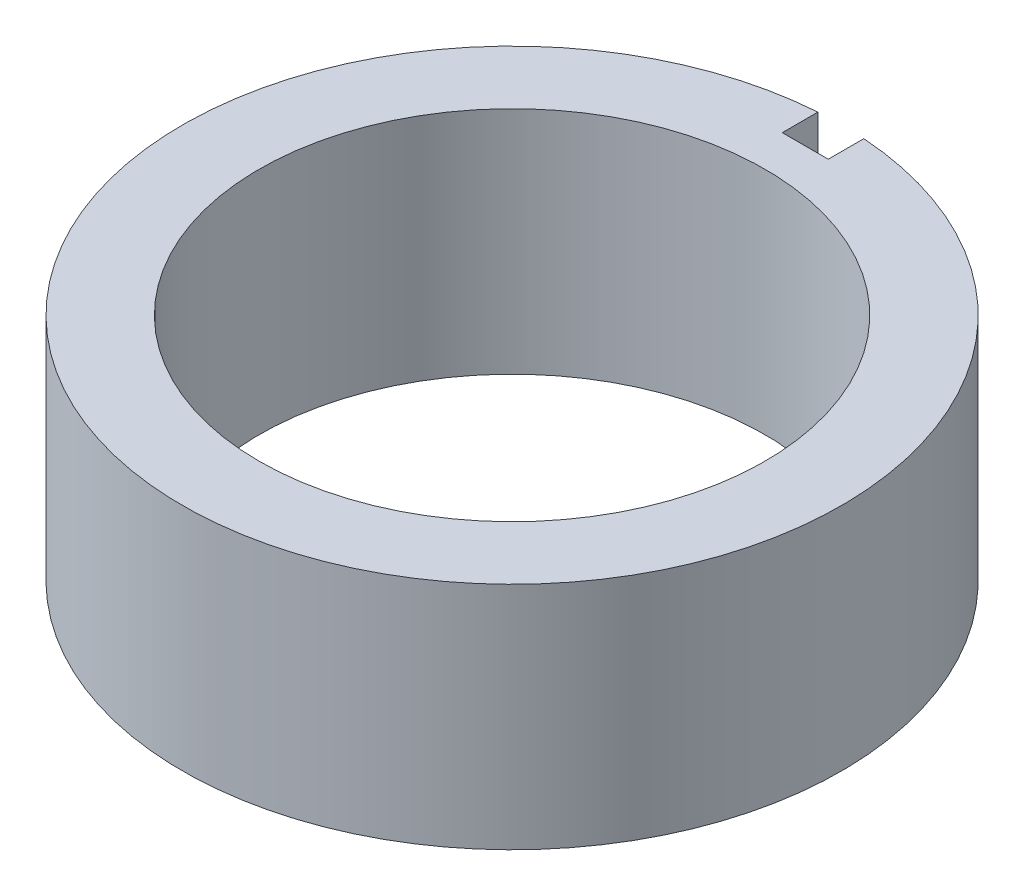
ISO-10303-21;
HEADER;
FILE_DESCRIPTION(('STEP AP214'),'2;1');
FILE_NAME('part.step','',(''),(''),'','','');
FILE_SCHEMA(('AUTOMOTIVE_DESIGN { 1 0 10303 214 1 1 1 1 }'));
ENDSEC;
DATA;
#1=APPLICATION_CONTEXT('core data for automotive mechanical design processes');
#2=APPLICATION_PROTOCOL_DEFINITION('international standard','automotive_design',2000,#1);
#3=PRODUCT_CONTEXT('',#1,'mechanical');
#4=PRODUCT('Part','Part','',(#3));
#5=PRODUCT_RELATED_PRODUCT_CATEGORY('part','',(#4));
#6=PRODUCT_DEFINITION_FORMATION('','',#4);
#7=PRODUCT_DEFINITION_CONTEXT('part definition',#1,'design');
#8=PRODUCT_DEFINITION('design','',#6,#7);
#9=PRODUCT_DEFINITION_SHAPE('','',#8);
#10=(LENGTH_UNIT() NAMED_UNIT(*) SI_UNIT(.MILLI.,.METRE.));
#11=(NAMED_UNIT(*) PLANE_ANGLE_UNIT() SI_UNIT($,.RADIAN.));
#12=(NAMED_UNIT(*) SI_UNIT($,.STERADIAN.) SOLID_ANGLE_UNIT());
#13=UNCERTAINTY_MEASURE_WITH_UNIT(LENGTH_MEASURE(1.E-05),#10,'distance_accuracy_value','');
#14=(GEOMETRIC_REPRESENTATION_CONTEXT(3) GLOBAL_UNCERTAINTY_ASSIGNED_CONTEXT((#13)) GLOBAL_UNIT_ASSIGNED_CONTEXT((#10,
#11,#12)) REPRESENTATION_CONTEXT('',''));
#15=CARTESIAN_POINT('',(0.,0.,0.));
#16=DIRECTION('',(0.,0.,1.));
#17=DIRECTION('',(1.,0.,0.));
#18=AXIS2_PLACEMENT_3D('',#15,#16,#17);
#19=CARTESIAN_POINT('',(0.,30.,0.));
#20=DIRECTION('',(0.,1.,0.));
#21=DIRECTION('',(0.,0.,1.));
#22=AXIS2_PLACEMENT_3D('',#19,#20,#21);
#23=PLANE('',#22);
#24=CARTESIAN_POINT('',(0.,30.,0.));
#25=DIRECTION('',(0.,1.,0.));
#26=DIRECTION('',(0.,0.,1.));
#27=AXIS2_PLACEMENT_3D('',#24,#25,#26);
#28=CIRCLE('',#27,43.);
#29=CARTESIAN_POINT('',(-3.00000000000001,30.,-42.8952211790544));
#30=VERTEX_POINT('',#29);
#31=CARTESIAN_POINT('',(2.99999999999999,30.,-42.8952211790544));
#32=VERTEX_POINT('',#31);
#33=EDGE_CURVE('E88',#30,#32,#28,.T.);
#34=ORIENTED_EDGE('',*,*,#33,.T.);
#35=DIRECTION('',(0.,0.,1.));
#36=VECTOR('',#35,1.);
#37=CARTESIAN_POINT('',(2.99999999999999,30.,-42.8952211790544));
#38=LINE('',#37,#36);
#39=CARTESIAN_POINT('',(2.99999999999999,30.,-38.2516874207032));
#40=VERTEX_POINT('',#39);
#41=EDGE_CURVE('E83',#32,#40,#38,.T.);
#42=ORIENTED_EDGE('',*,*,#41,.T.);
#43=DIRECTION('',(-1.,0.,0.));
#44=VECTOR('',#43,1.);
#45=CARTESIAN_POINT('',(-3.,30.,-38.2516874207032));
#46=LINE('',#45,#44);
#47=CARTESIAN_POINT('',(-3.,30.,-38.2516874207032));
#48=VERTEX_POINT('',#47);
#49=EDGE_CURVE('E86',#40,#48,#46,.T.);
#50=ORIENTED_EDGE('',*,*,#49,.T.);
#51=DIRECTION('',(0.,0.,-1.));
#52=VECTOR('',#51,1.);
#53=CARTESIAN_POINT('',(-3.00000000000001,30.,-42.8952211790544));
#54=LINE('',#53,#52);
#55=EDGE_CURVE('E53',#48,#30,#54,.T.);
#56=ORIENTED_EDGE('',*,*,#55,.T.);
#57=EDGE_LOOP('',(#34,#42,#50,#56));
#58=FACE_BOUND('',#57,.T.);
#59=CARTESIAN_POINT('',(0.,30.,0.));
#60=DIRECTION('',(0.,1.,0.));
#61=DIRECTION('',(0.,0.,1.));
#62=AXIS2_PLACEMENT_3D('',#59,#60,#61);
#63=CIRCLE('',#62,33.);
#64=CARTESIAN_POINT('',(0.,30.,33.));
#65=VERTEX_POINT('',#64);
#66=EDGE_CURVE('E103',#65,#65,#63,.T.);
#67=ORIENTED_EDGE('',*,*,#66,.F.);
#68=EDGE_LOOP('',(#67));
#69=FACE_BOUND('',#68,.T.);
#70=ADVANCED_FACE('F36',(#58,#69),#23,.T.);
#71=CARTESIAN_POINT('',(0.,0.,0.));
#72=DIRECTION('',(0.,1.,0.));
#73=DIRECTION('',(0.,0.,1.));
#74=AXIS2_PLACEMENT_3D('',#71,#72,#73);
#75=PLANE('',#74);
#76=CARTESIAN_POINT('',(0.,0.,0.));
#77=DIRECTION('',(0.,1.,0.));
#78=DIRECTION('',(0.,0.,1.));
#79=AXIS2_PLACEMENT_3D('',#76,#77,#78);
#80=CIRCLE('',#79,43.);
#81=CARTESIAN_POINT('',(-3.00000000000001,0.,-42.8952211790544));
#82=VERTEX_POINT('',#81);
#83=CARTESIAN_POINT('',(2.99999999999999,0.,-42.8952211790544));
#84=VERTEX_POINT('',#83);
#85=EDGE_CURVE('E100',#82,#84,#80,.T.);
#86=ORIENTED_EDGE('',*,*,#85,.F.);
#87=DIRECTION('',(0.,0.,-1.));
#88=VECTOR('',#87,1.);
#89=CARTESIAN_POINT('',(-3.00000000000001,0.,-42.8952211790544));
#90=LINE('',#89,#88);
#91=CARTESIAN_POINT('',(-3.,0.,-38.2516874207032));
#92=VERTEX_POINT('',#91);
#93=EDGE_CURVE('E76',#92,#82,#90,.T.);
#94=ORIENTED_EDGE('',*,*,#93,.F.);
#95=DIRECTION('',(-1.,0.,0.));
#96=VECTOR('',#95,1.);
#97=CARTESIAN_POINT('',(-3.,0.,-38.2516874207032));
#98=LINE('',#97,#96);
#99=CARTESIAN_POINT('',(2.99999999999999,0.,-38.2516874207032));
#100=VERTEX_POINT('',#99);
#101=EDGE_CURVE('E70',#100,#92,#98,.T.);
#102=ORIENTED_EDGE('',*,*,#101,.F.);
#103=DIRECTION('',(0.,0.,1.));
#104=VECTOR('',#103,1.);
#105=CARTESIAN_POINT('',(2.99999999999999,0.,-42.8952211790544));
#106=LINE('',#105,#104);
#107=EDGE_CURVE('E92',#84,#100,#106,.T.);
#108=ORIENTED_EDGE('',*,*,#107,.F.);
#109=EDGE_LOOP('',(#86,#94,#102,#108));
#110=FACE_BOUND('',#109,.T.);
#111=CARTESIAN_POINT('',(0.,0.,0.));
#112=DIRECTION('',(0.,1.,0.));
#113=DIRECTION('',(0.,0.,1.));
#114=AXIS2_PLACEMENT_3D('',#111,#112,#113);
#115=CIRCLE('',#114,33.);
#116=CARTESIAN_POINT('',(0.,0.,33.));
#117=VERTEX_POINT('',#116);
#118=EDGE_CURVE('E115',#117,#117,#115,.T.);
#119=ORIENTED_EDGE('',*,*,#118,.T.);
#120=EDGE_LOOP('',(#119));
#121=FACE_BOUND('',#120,.T.);
#122=ADVANCED_FACE('F111',(#110,#121),#75,.F.);
#123=CARTESIAN_POINT('',(0.,30.,0.));
#124=DIRECTION('',(0.,-1.,0.));
#125=DIRECTION('',(0.,0.,-1.));
#126=AXIS2_PLACEMENT_3D('',#123,#124,#125);
#127=CYLINDRICAL_SURFACE('',#126,43.);
#128=ORIENTED_EDGE('',*,*,#85,.T.);
#129=DIRECTION('',(0.,-1.,0.));
#130=VECTOR('',#129,1.);
#131=CARTESIAN_POINT('',(2.99999999999999,30.,-42.8952211790544));
#132=LINE('',#131,#130);
#133=EDGE_CURVE('E11',#32,#84,#132,.T.);
#134=ORIENTED_EDGE('',*,*,#133,.F.);
#135=ORIENTED_EDGE('',*,*,#33,.F.);
#136=DIRECTION('',(0.,-1.,0.));
#137=VECTOR('',#136,1.);
#138=CARTESIAN_POINT('',(-3.00000000000001,30.,-42.8952211790544));
#139=LINE('',#138,#137);
#140=EDGE_CURVE('E96',#30,#82,#139,.T.);
#141=ORIENTED_EDGE('',*,*,#140,.T.);
#142=EDGE_LOOP('',(#128,#134,#135,#141));
#143=FACE_BOUND('',#142,.T.);
#144=ADVANCED_FACE('F38',(#143),#127,.T.);
#145=CARTESIAN_POINT('',(2.99999999999999,30.,-42.8952211790544));
#146=DIRECTION('',(1.,0.,0.));
#147=DIRECTION('',(0.,0.,-1.));
#148=AXIS2_PLACEMENT_3D('',#145,#146,#147);
#149=PLANE('',#148);
#150=ORIENTED_EDGE('',*,*,#107,.T.);
#151=DIRECTION('',(0.,-1.,0.));
#152=VECTOR('',#151,1.);
#153=CARTESIAN_POINT('',(2.99999999999999,30.,-38.2516874207032));
#154=LINE('',#153,#152);
#155=EDGE_CURVE('E45',#40,#100,#154,.T.);
#156=ORIENTED_EDGE('',*,*,#155,.F.);
#157=ORIENTED_EDGE('',*,*,#41,.F.);
#158=ORIENTED_EDGE('',*,*,#133,.T.);
#159=EDGE_LOOP('',(#150,#156,#157,#158));
#160=FACE_BOUND('',#159,.T.);
#161=ADVANCED_FACE('F91',(#160),#149,.F.);
#162=CARTESIAN_POINT('',(-3.,30.,-38.2516874207032));
#163=DIRECTION('',(0.,0.,1.));
#164=DIRECTION('',(1.,0.,0.));
#165=AXIS2_PLACEMENT_3D('',#162,#163,#164);
#166=PLANE('',#165);
#167=ORIENTED_EDGE('',*,*,#101,.T.);
#168=DIRECTION('',(0.,-1.,0.));
#169=VECTOR('',#168,1.);
#170=CARTESIAN_POINT('',(-3.,30.,-38.2516874207032));
#171=LINE('',#170,#169);
#172=EDGE_CURVE('E93',#48,#92,#171,.T.);
#173=ORIENTED_EDGE('',*,*,#172,.F.);
#174=ORIENTED_EDGE('',*,*,#49,.F.);
#175=ORIENTED_EDGE('',*,*,#155,.T.);
#176=EDGE_LOOP('',(#167,#173,#174,#175));
#177=FACE_BOUND('',#176,.T.);
#178=ADVANCED_FACE('F94',(#177),#166,.F.);
#179=CARTESIAN_POINT('',(-3.00000000000001,30.,-42.8952211790544));
#180=DIRECTION('',(-1.,0.,0.));
#181=DIRECTION('',(0.,0.,1.));
#182=AXIS2_PLACEMENT_3D('',#179,#180,#181);
#183=PLANE('',#182);
#184=ORIENTED_EDGE('',*,*,#93,.T.);
#185=ORIENTED_EDGE('',*,*,#140,.F.);
#186=ORIENTED_EDGE('',*,*,#55,.F.);
#187=ORIENTED_EDGE('',*,*,#172,.T.);
#188=EDGE_LOOP('',(#184,#185,#186,#187));
#189=FACE_BOUND('',#188,.T.);
#190=ADVANCED_FACE('F108',(#189),#183,.F.);
#191=CARTESIAN_POINT('',(0.,30.,0.));
#192=DIRECTION('',(0.,-1.,0.));
#193=DIRECTION('',(0.,0.,-1.));
#194=AXIS2_PLACEMENT_3D('',#191,#192,#193);
#195=CYLINDRICAL_SURFACE('',#194,33.);
#196=ORIENTED_EDGE('',*,*,#66,.T.);
#197=EDGE_LOOP('',(#196));
#198=FACE_BOUND('',#197,.T.);
#199=ORIENTED_EDGE('',*,*,#118,.F.);
#200=EDGE_LOOP('',(#199));
#201=FACE_BOUND('',#200,.T.);
#202=ADVANCED_FACE('F121',(#198,#201),#195,.F.);
#203=CLOSED_SHELL('',(#70,#122,#144,#161,#178,#190,#202));
#204=MANIFOLD_SOLID_BREP('B2',#203);
#205=ADVANCED_BREP_SHAPE_REPRESENTATION('',(#18,#204),#14);
#206=SHAPE_DEFINITION_REPRESENTATION(#9,#205);
ENDSEC;
END-ISO-10303-21;
